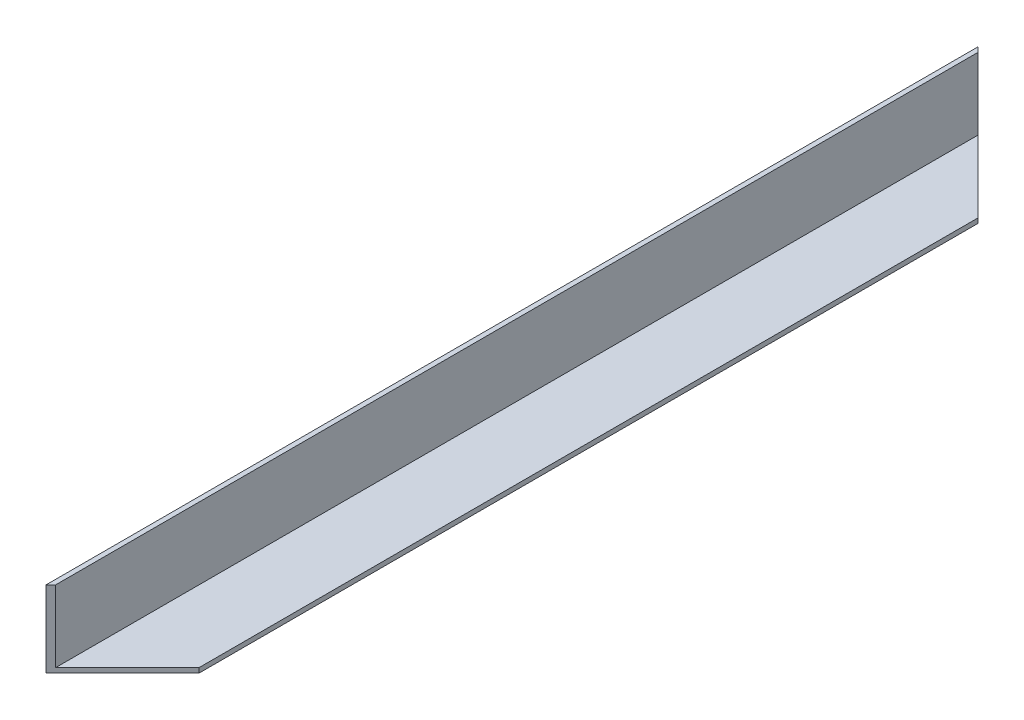
ISO-10303-21;
HEADER;
FILE_DESCRIPTION(('STEP AP214'),'2;1');
FILE_NAME('part.step','',(''),(''),'','','');
FILE_SCHEMA(('AUTOMOTIVE_DESIGN { 1 0 10303 214 1 1 1 1 }'));
ENDSEC;
DATA;
#1=APPLICATION_CONTEXT('core data for automotive mechanical design processes');
#2=APPLICATION_PROTOCOL_DEFINITION('international standard','automotive_design',2000,#1);
#3=PRODUCT_CONTEXT('',#1,'mechanical');
#4=PRODUCT('Part','Part','',(#3));
#5=PRODUCT_RELATED_PRODUCT_CATEGORY('part','',(#4));
#6=PRODUCT_DEFINITION_FORMATION('','',#4);
#7=PRODUCT_DEFINITION_CONTEXT('part definition',#1,'design');
#8=PRODUCT_DEFINITION('design','',#6,#7);
#9=PRODUCT_DEFINITION_SHAPE('','',#8);
#10=(LENGTH_UNIT() NAMED_UNIT(*) SI_UNIT(.MILLI.,.METRE.));
#11=(NAMED_UNIT(*) PLANE_ANGLE_UNIT() SI_UNIT($,.RADIAN.));
#12=(NAMED_UNIT(*) SI_UNIT($,.STERADIAN.) SOLID_ANGLE_UNIT());
#13=UNCERTAINTY_MEASURE_WITH_UNIT(LENGTH_MEASURE(1.E-05),#10,'distance_accuracy_value','');
#14=(GEOMETRIC_REPRESENTATION_CONTEXT(3) GLOBAL_UNCERTAINTY_ASSIGNED_CONTEXT((#13)) GLOBAL_UNIT_ASSIGNED_CONTEXT((#10,
#11,#12)) REPRESENTATION_CONTEXT('',''));
#15=CARTESIAN_POINT('',(0.,0.,0.));
#16=DIRECTION('',(0.,0.,1.));
#17=DIRECTION('',(1.,0.,0.));
#18=AXIS2_PLACEMENT_3D('',#15,#16,#17);
#19=CARTESIAN_POINT('',(0.,-2.,390.));
#20=DIRECTION('',(0.,1.,0.));
#21=DIRECTION('',(0.,0.,1.));
#22=AXIS2_PLACEMENT_3D('',#19,#20,#21);
#23=PLANE('',#22);
#24=DIRECTION('',(0.,0.,-1.));
#25=VECTOR('',#24,1.);
#26=CARTESIAN_POINT('',(30.,-2.,390.));
#27=LINE('',#26,#25);
#28=CARTESIAN_POINT('',(30.,-2.,358.));
#29=VERTEX_POINT('',#28);
#30=CARTESIAN_POINT('',(30.,-2.,32.));
#31=VERTEX_POINT('',#30);
#32=EDGE_CURVE('E11',#29,#31,#27,.T.);
#33=ORIENTED_EDGE('',*,*,#32,.F.);
#34=DIRECTION('',(0.707106781186547,0.,-0.707106781186548));
#35=VECTOR('',#34,1.);
#36=CARTESIAN_POINT('',(-2.,-2.,390.));
#37=LINE('',#36,#35);
#38=CARTESIAN_POINT('',(-2.,-2.,390.));
#39=VERTEX_POINT('',#38);
#40=EDGE_CURVE('E78',#39,#29,#37,.T.);
#41=ORIENTED_EDGE('',*,*,#40,.F.);
#42=DIRECTION('',(0.,0.,-1.));
#43=VECTOR('',#42,1.);
#44=CARTESIAN_POINT('',(-2.,-2.,390.));
#45=LINE('',#44,#43);
#46=CARTESIAN_POINT('',(-2.,-2.,0.));
#47=VERTEX_POINT('',#46);
#48=EDGE_CURVE('E99',#39,#47,#45,.T.);
#49=ORIENTED_EDGE('',*,*,#48,.T.);
#50=DIRECTION('',(-0.707106781186547,0.,-0.707106781186548));
#51=VECTOR('',#50,1.);
#52=CARTESIAN_POINT('',(-2.,-2.,0.));
#53=LINE('',#52,#51);
#54=EDGE_CURVE('E98',#31,#47,#53,.T.);
#55=ORIENTED_EDGE('',*,*,#54,.F.);
#56=EDGE_LOOP('',(#33,#41,#49,#55));
#57=FACE_BOUND('',#56,.T.);
#58=ADVANCED_FACE('F33',(#57),#23,.F.);
#59=CARTESIAN_POINT('',(30.,0.,390.));
#60=DIRECTION('',(1.,0.,0.));
#61=DIRECTION('',(0.,0.,-1.));
#62=AXIS2_PLACEMENT_3D('',#59,#60,#61);
#63=PLANE('',#62);
#64=DIRECTION('',(0.,-1.,0.));
#65=VECTOR('',#64,1.);
#66=CARTESIAN_POINT('',(30.,30.,358.));
#67=LINE('',#66,#65);
#68=CARTESIAN_POINT('',(30.,0.,358.));
#69=VERTEX_POINT('',#68);
#70=EDGE_CURVE('E81',#69,#29,#67,.T.);
#71=ORIENTED_EDGE('',*,*,#70,.T.);
#72=ORIENTED_EDGE('',*,*,#32,.T.);
#73=DIRECTION('',(0.,-1.,0.));
#74=VECTOR('',#73,1.);
#75=CARTESIAN_POINT('',(30.,30.,32.));
#76=LINE('',#75,#74);
#77=CARTESIAN_POINT('',(30.,0.,32.));
#78=VERTEX_POINT('',#77);
#79=EDGE_CURVE('E106',#78,#31,#76,.T.);
#80=ORIENTED_EDGE('',*,*,#79,.F.);
#81=DIRECTION('',(0.,0.,-1.));
#82=VECTOR('',#81,1.);
#83=CARTESIAN_POINT('',(30.,0.,390.));
#84=LINE('',#83,#82);
#85=EDGE_CURVE('E41',#69,#78,#84,.T.);
#86=ORIENTED_EDGE('',*,*,#85,.F.);
#87=EDGE_LOOP('',(#71,#72,#80,#86));
#88=FACE_BOUND('',#87,.T.);
#89=ADVANCED_FACE('F92',(#88),#63,.T.);
#90=CARTESIAN_POINT('',(0.,0.,390.));
#91=DIRECTION('',(0.,1.,0.));
#92=DIRECTION('',(0.,0.,1.));
#93=AXIS2_PLACEMENT_3D('',#90,#91,#92);
#94=PLANE('',#93);
#95=DIRECTION('',(-0.707106781186547,0.,0.707106781186548));
#96=VECTOR('',#95,1.);
#97=CARTESIAN_POINT('',(-1.,0.,389.));
#98=LINE('',#97,#96);
#99=CARTESIAN_POINT('',(0.,0.,388.));
#100=VERTEX_POINT('',#99);
#101=EDGE_CURVE('E103',#69,#100,#98,.T.);
#102=ORIENTED_EDGE('',*,*,#101,.F.);
#103=ORIENTED_EDGE('',*,*,#85,.T.);
#104=DIRECTION('',(0.707106781186547,0.,0.707106781186548));
#105=VECTOR('',#104,1.);
#106=CARTESIAN_POINT('',(194.,0.,196.));
#107=LINE('',#106,#105);
#108=CARTESIAN_POINT('',(0.,0.,1.99999999999995));
#109=VERTEX_POINT('',#108);
#110=EDGE_CURVE('E114',#109,#78,#107,.T.);
#111=ORIENTED_EDGE('',*,*,#110,.F.);
#112=DIRECTION('',(0.,0.,-1.));
#113=VECTOR('',#112,1.);
#114=CARTESIAN_POINT('',(0.,0.,390.));
#115=LINE('',#114,#113);
#116=EDGE_CURVE('E126',#100,#109,#115,.T.);
#117=ORIENTED_EDGE('',*,*,#116,.F.);
#118=EDGE_LOOP('',(#102,#103,#111,#117));
#119=FACE_BOUND('',#118,.T.);
#120=ADVANCED_FACE('F129',(#119),#94,.T.);
#121=CARTESIAN_POINT('',(0.,0.,390.));
#122=DIRECTION('',(1.,0.,0.));
#123=DIRECTION('',(0.,0.,-1.));
#124=AXIS2_PLACEMENT_3D('',#121,#122,#123);
#125=PLANE('',#124);
#126=DIRECTION('',(0.,1.,0.));
#127=VECTOR('',#126,1.);
#128=CARTESIAN_POINT('',(0.,0.,388.));
#129=LINE('',#128,#127);
#130=CARTESIAN_POINT('',(0.,30.,388.));
#131=VERTEX_POINT('',#130);
#132=EDGE_CURVE('E95',#100,#131,#129,.T.);
#133=ORIENTED_EDGE('',*,*,#132,.F.);
#134=ORIENTED_EDGE('',*,*,#116,.T.);
#135=DIRECTION('',(0.,-1.,0.));
#136=VECTOR('',#135,1.);
#137=CARTESIAN_POINT('',(0.,0.,1.99999999999995));
#138=LINE('',#137,#136);
#139=CARTESIAN_POINT('',(0.,30.,1.99999999999992));
#140=VERTEX_POINT('',#139);
#141=EDGE_CURVE('E111',#140,#109,#138,.T.);
#142=ORIENTED_EDGE('',*,*,#141,.F.);
#143=DIRECTION('',(0.,0.,-1.));
#144=VECTOR('',#143,1.);
#145=CARTESIAN_POINT('',(0.,30.,390.));
#146=LINE('',#145,#144);
#147=EDGE_CURVE('E124',#131,#140,#146,.T.);
#148=ORIENTED_EDGE('',*,*,#147,.F.);
#149=EDGE_LOOP('',(#133,#134,#142,#148));
#150=FACE_BOUND('',#149,.T.);
#151=ADVANCED_FACE('F137',(#150),#125,.T.);
#152=CARTESIAN_POINT('',(-2.,30.,390.));
#153=DIRECTION('',(0.,1.,0.));
#154=DIRECTION('',(0.,0.,1.));
#155=AXIS2_PLACEMENT_3D('',#152,#153,#154);
#156=PLANE('',#155);
#157=DIRECTION('',(0.707106781186547,0.,-0.707106781186548));
#158=VECTOR('',#157,1.);
#159=CARTESIAN_POINT('',(-2.,30.,390.));
#160=LINE('',#159,#158);
#161=CARTESIAN_POINT('',(-2.,30.,390.));
#162=VERTEX_POINT('',#161);
#163=EDGE_CURVE('E47',#162,#131,#160,.T.);
#164=ORIENTED_EDGE('',*,*,#163,.T.);
#165=ORIENTED_EDGE('',*,*,#147,.T.);
#166=DIRECTION('',(-0.707106781186547,0.,-0.707106781186548));
#167=VECTOR('',#166,1.);
#168=CARTESIAN_POINT('',(-2.,30.,0.));
#169=LINE('',#168,#167);
#170=CARTESIAN_POINT('',(-2.,30.,0.));
#171=VERTEX_POINT('',#170);
#172=EDGE_CURVE('E102',#140,#171,#169,.T.);
#173=ORIENTED_EDGE('',*,*,#172,.T.);
#174=DIRECTION('',(0.,0.,-1.));
#175=VECTOR('',#174,1.);
#176=CARTESIAN_POINT('',(-2.,30.,390.));
#177=LINE('',#176,#175);
#178=EDGE_CURVE('E121',#162,#171,#177,.T.);
#179=ORIENTED_EDGE('',*,*,#178,.F.);
#180=EDGE_LOOP('',(#164,#165,#173,#179));
#181=FACE_BOUND('',#180,.T.);
#182=ADVANCED_FACE('F141',(#181),#156,.T.);
#183=CARTESIAN_POINT('',(-2.,0.,390.));
#184=DIRECTION('',(1.,0.,0.));
#185=DIRECTION('',(0.,0.,-1.));
#186=AXIS2_PLACEMENT_3D('',#183,#184,#185);
#187=PLANE('',#186);
#188=DIRECTION('',(0.,1.,0.));
#189=VECTOR('',#188,1.);
#190=CARTESIAN_POINT('',(-2.,0.,0.));
#191=LINE('',#190,#189);
#192=EDGE_CURVE('E117',#171,#47,#191,.F.);
#193=ORIENTED_EDGE('',*,*,#192,.T.);
#194=ORIENTED_EDGE('',*,*,#48,.F.);
#195=DIRECTION('',(0.,1.,0.));
#196=VECTOR('',#195,1.);
#197=CARTESIAN_POINT('',(-2.,0.,390.));
#198=LINE('',#197,#196);
#199=EDGE_CURVE('E84',#162,#39,#198,.F.);
#200=ORIENTED_EDGE('',*,*,#199,.F.);
#201=ORIENTED_EDGE('',*,*,#178,.T.);
#202=EDGE_LOOP('',(#193,#194,#200,#201));
#203=FACE_BOUND('',#202,.T.);
#204=ADVANCED_FACE('F143',(#203),#187,.F.);
#205=CARTESIAN_POINT('',(-2.,30.,0.));
#206=DIRECTION('',(-0.707106781186548,0.,0.707106781186547));
#207=DIRECTION('',(0.707106781186547,0.,0.707106781186548));
#208=AXIS2_PLACEMENT_3D('',#205,#206,#207);
#209=PLANE('',#208);
#210=ORIENTED_EDGE('',*,*,#110,.T.);
#211=ORIENTED_EDGE('',*,*,#79,.T.);
#212=ORIENTED_EDGE('',*,*,#54,.T.);
#213=ORIENTED_EDGE('',*,*,#192,.F.);
#214=ORIENTED_EDGE('',*,*,#172,.F.);
#215=ORIENTED_EDGE('',*,*,#141,.T.);
#216=EDGE_LOOP('',(#210,#211,#212,#213,#214,#215));
#217=FACE_BOUND('',#216,.T.);
#218=ADVANCED_FACE('F131',(#217),#209,.F.);
#219=CARTESIAN_POINT('',(-2.,30.,390.));
#220=DIRECTION('',(-0.707106781186548,0.,-0.707106781186547));
#221=DIRECTION('',(-0.707106781186547,0.,0.707106781186548));
#222=AXIS2_PLACEMENT_3D('',#219,#220,#221);
#223=PLANE('',#222);
#224=ORIENTED_EDGE('',*,*,#101,.T.);
#225=ORIENTED_EDGE('',*,*,#132,.T.);
#226=ORIENTED_EDGE('',*,*,#163,.F.);
#227=ORIENTED_EDGE('',*,*,#199,.T.);
#228=ORIENTED_EDGE('',*,*,#40,.T.);
#229=ORIENTED_EDGE('',*,*,#70,.F.);
#230=EDGE_LOOP('',(#224,#225,#226,#227,#228,#229));
#231=FACE_BOUND('',#230,.T.);
#232=ADVANCED_FACE('F80',(#231),#223,.F.);
#233=CLOSED_SHELL('',(#58,#89,#120,#151,#182,#204,#218,#232));
#234=MANIFOLD_SOLID_BREP('B2',#233);
#235=ADVANCED_BREP_SHAPE_REPRESENTATION('',(#18,#234),#14);
#236=SHAPE_DEFINITION_REPRESENTATION(#9,#235);
ENDSEC;
END-ISO-10303-21;
